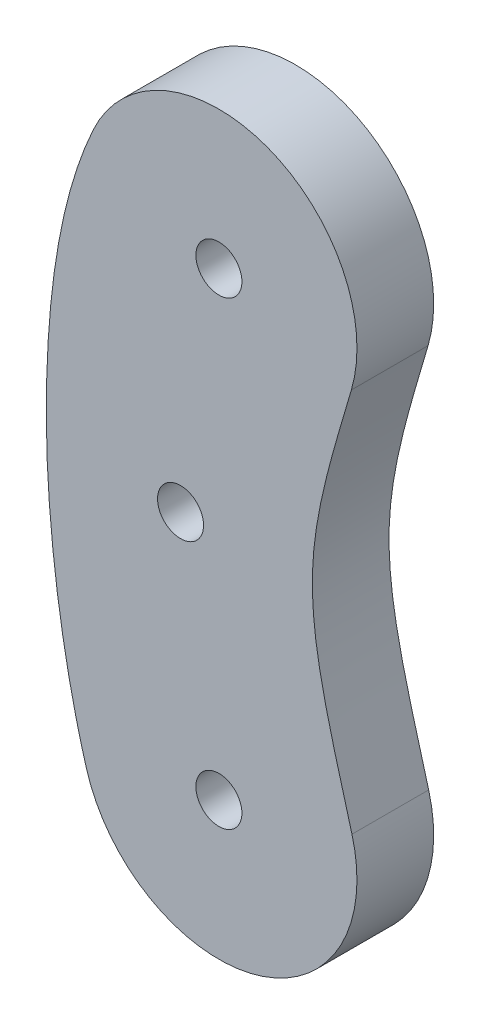
ISO-10303-21;
HEADER;
FILE_DESCRIPTION(('STEP AP214'),'2;1');
FILE_NAME('part.step','',(''),(''),'','','');
FILE_SCHEMA(('AUTOMOTIVE_DESIGN { 1 0 10303 214 1 1 1 1 }'));
ENDSEC;
DATA;
#1=APPLICATION_CONTEXT('core data for automotive mechanical design processes');
#2=APPLICATION_PROTOCOL_DEFINITION('international standard','automotive_design',2000,#1);
#3=PRODUCT_CONTEXT('',#1,'mechanical');
#4=PRODUCT('Part','Part','',(#3));
#5=PRODUCT_RELATED_PRODUCT_CATEGORY('part','',(#4));
#6=PRODUCT_DEFINITION_FORMATION('','',#4);
#7=PRODUCT_DEFINITION_CONTEXT('part definition',#1,'design');
#8=PRODUCT_DEFINITION('design','',#6,#7);
#9=PRODUCT_DEFINITION_SHAPE('','',#8);
#10=(LENGTH_UNIT() NAMED_UNIT(*) SI_UNIT(.MILLI.,.METRE.));
#11=(NAMED_UNIT(*) PLANE_ANGLE_UNIT() SI_UNIT($,.RADIAN.));
#12=(NAMED_UNIT(*) SI_UNIT($,.STERADIAN.) SOLID_ANGLE_UNIT());
#13=UNCERTAINTY_MEASURE_WITH_UNIT(LENGTH_MEASURE(1.E-05),#10,'distance_accuracy_value','');
#14=(GEOMETRIC_REPRESENTATION_CONTEXT(3) GLOBAL_UNCERTAINTY_ASSIGNED_CONTEXT((#13)) GLOBAL_UNIT_ASSIGNED_CONTEXT((#10,
#11,#12)) REPRESENTATION_CONTEXT('',''));
#15=CARTESIAN_POINT('',(0.,0.,0.));
#16=DIRECTION('',(0.,0.,1.));
#17=DIRECTION('',(1.,0.,0.));
#18=AXIS2_PLACEMENT_3D('',#15,#16,#17);
#19=CARTESIAN_POINT('',(-8.17760203971426,33.7585668651843,5.));
#20=CARTESIAN_POINT('',(-10.2391210109085,29.273271711889,5.));
#21=CARTESIAN_POINT('',(-11.4499871436267,20.9432649609992,5.));
#22=CARTESIAN_POINT('',(-11.1136661993933,8.88333020494128,5.));
#23=CARTESIAN_POINT('',(-9.76929203164389,1.29153840888373,5.));
#24=CARTESIAN_POINT('',(-8.62926724426962,-2.55651067413679,5.));
#25=B_SPLINE_CURVE_WITH_KNOTS('',3,(#19,#20,#21,#22,#23,#24),.UNSPECIFIED.,.F.,.F.,(4,1,1,4),
(0.,0.412769953090138,0.646915450195841,1.),.UNSPECIFIED.);
#26=DIRECTION('',(0.,0.,-1.));
#27=VECTOR('',#26,1.);
#28=SURFACE_OF_LINEAR_EXTRUSION('',#25,#27);
#29=CARTESIAN_POINT('',(-8.17760203971426,33.7585668651843,0.));
#30=CARTESIAN_POINT('',(-10.2391210109085,29.273271711889,0.));
#31=CARTESIAN_POINT('',(-11.4499871436267,20.9432649609992,0.));
#32=CARTESIAN_POINT('',(-11.1136661993933,8.88333020494128,0.));
#33=CARTESIAN_POINT('',(-9.76929203164389,1.29153840888373,0.));
#34=CARTESIAN_POINT('',(-8.62926724426962,-2.55651067413679,0.));
#35=B_SPLINE_CURVE_WITH_KNOTS('',3,(#29,#30,#31,#32,#33,#34),.UNSPECIFIED.,.F.,.F.,(4,1,1,4),
(0.,0.412769953090138,0.646915450195841,1.),.UNSPECIFIED.);
#36=CARTESIAN_POINT('',(-8.17760203971426,33.7585668651843,0.));
#37=VERTEX_POINT('',#36);
#38=CARTESIAN_POINT('',(-8.62926724426962,-2.55651067413679,0.));
#39=VERTEX_POINT('',#38);
#40=EDGE_CURVE('E122',#37,#39,#35,.T.);
#41=ORIENTED_EDGE('',*,*,#40,.T.);
#42=DIRECTION('',(0.,0.,-1.));
#43=VECTOR('',#42,1.);
#44=CARTESIAN_POINT('',(-8.62926724426962,-2.55651067413679,5.));
#45=LINE('',#44,#43);
#46=CARTESIAN_POINT('',(-8.62926724426962,-2.55651067413679,5.));
#47=VERTEX_POINT('',#46);
#48=EDGE_CURVE('E11',#47,#39,#45,.T.);
#49=ORIENTED_EDGE('',*,*,#48,.F.);
#50=CARTESIAN_POINT('',(-8.17760203971426,33.7585668651843,5.));
#51=VERTEX_POINT('',#50);
#52=EDGE_CURVE('E90',#51,#47,#25,.T.);
#53=ORIENTED_EDGE('',*,*,#52,.F.);
#54=DIRECTION('',(0.,0.,-1.));
#55=VECTOR('',#54,1.);
#56=CARTESIAN_POINT('',(-8.17760203971426,33.7585668651843,5.));
#57=LINE('',#56,#55);
#58=EDGE_CURVE('E99',#51,#37,#57,.T.);
#59=ORIENTED_EDGE('',*,*,#58,.T.);
#60=EDGE_LOOP('',(#41,#49,#53,#59));
#61=FACE_BOUND('',#60,.T.);
#62=ADVANCED_FACE('F36',(#61),#28,.F.);
#63=CARTESIAN_POINT('',(0.,0.,5.));
#64=DIRECTION('',(0.,0.,-1.));
#65=DIRECTION('',(-1.,0.,0.));
#66=AXIS2_PLACEMENT_3D('',#63,#64,#65);
#67=CYLINDRICAL_SURFACE('',#66,9.);
#68=CARTESIAN_POINT('',(0.,0.,0.));
#69=DIRECTION('',(0.,0.,1.));
#70=DIRECTION('',(1.,0.,0.));
#71=AXIS2_PLACEMENT_3D('',#68,#69,#70);
#72=CIRCLE('',#71,9.);
#73=CARTESIAN_POINT('',(8.67370320383982,2.40143139225313,0.));
#74=VERTEX_POINT('',#73);
#75=EDGE_CURVE('E94',#39,#74,#72,.T.);
#76=ORIENTED_EDGE('',*,*,#75,.T.);
#77=DIRECTION('',(0.,0.,-1.));
#78=VECTOR('',#77,1.);
#79=CARTESIAN_POINT('',(8.67370320383982,2.40143139225313,5.));
#80=LINE('',#79,#78);
#81=CARTESIAN_POINT('',(8.67370320383982,2.40143139225313,5.));
#82=VERTEX_POINT('',#81);
#83=EDGE_CURVE('E46',#82,#74,#80,.T.);
#84=ORIENTED_EDGE('',*,*,#83,.F.);
#85=CARTESIAN_POINT('',(0.,0.,5.));
#86=DIRECTION('',(0.,0.,1.));
#87=DIRECTION('',(1.,0.,0.));
#88=AXIS2_PLACEMENT_3D('',#85,#86,#87);
#89=CIRCLE('',#88,9.);
#90=EDGE_CURVE('E85',#47,#82,#89,.T.);
#91=ORIENTED_EDGE('',*,*,#90,.F.);
#92=ORIENTED_EDGE('',*,*,#48,.T.);
#93=EDGE_LOOP('',(#76,#84,#91,#92));
#94=FACE_BOUND('',#93,.T.);
#95=ADVANCED_FACE('F93',(#94),#67,.T.);
#96=CARTESIAN_POINT('',(8.67370320383982,2.40143139225313,5.));
#97=CARTESIAN_POINT('',(7.07592914316869,8.17241366297816,5.));
#98=CARTESIAN_POINT('',(4.92199901240161,15.3247108466899,5.));
#99=CARTESIAN_POINT('',(7.43040424656678,23.3690768319561,5.));
#100=CARTESIAN_POINT('',(8.63398973606181,27.4594840607508,5.));
#101=B_SPLINE_CURVE_WITH_KNOTS('',3,(#96,#97,#98,#99,#100),.UNSPECIFIED.,.F.,.F.,(4,1,4),(0.,
0.557287963788278,1.),.UNSPECIFIED.);
#102=DIRECTION('',(0.,0.,-1.));
#103=VECTOR('',#102,1.);
#104=SURFACE_OF_LINEAR_EXTRUSION('',#101,#103);
#105=CARTESIAN_POINT('',(8.67370320383982,2.40143139225313,0.));
#106=CARTESIAN_POINT('',(7.07592914316869,8.17241366297816,0.));
#107=CARTESIAN_POINT('',(4.92199901240161,15.3247108466899,0.));
#108=CARTESIAN_POINT('',(7.43040424656678,23.3690768319561,0.));
#109=CARTESIAN_POINT('',(8.63398973606181,27.4594840607508,0.));
#110=B_SPLINE_CURVE_WITH_KNOTS('',3,(#105,#106,#107,#108,#109),.UNSPECIFIED.,.F.,.F.,(4,1,4),
(0.,0.557287963788278,1.),.UNSPECIFIED.);
#111=CARTESIAN_POINT('',(8.63398973606181,27.4594840607508,0.));
#112=VERTEX_POINT('',#111);
#113=EDGE_CURVE('E72',#74,#112,#110,.T.);
#114=ORIENTED_EDGE('',*,*,#113,.T.);
#115=DIRECTION('',(0.,0.,-1.));
#116=VECTOR('',#115,1.);
#117=CARTESIAN_POINT('',(8.63398973606181,27.4594840607508,5.));
#118=LINE('',#117,#116);
#119=CARTESIAN_POINT('',(8.63398973606181,27.4594840607508,5.));
#120=VERTEX_POINT('',#119);
#121=EDGE_CURVE('E95',#120,#112,#118,.T.);
#122=ORIENTED_EDGE('',*,*,#121,.F.);
#123=EDGE_CURVE('E88',#82,#120,#101,.T.);
#124=ORIENTED_EDGE('',*,*,#123,.F.);
#125=ORIENTED_EDGE('',*,*,#83,.T.);
#126=EDGE_LOOP('',(#114,#122,#124,#125));
#127=FACE_BOUND('',#126,.T.);
#128=ADVANCED_FACE('F97',(#127),#104,.F.);
#129=CARTESIAN_POINT('',(0.,30.,5.));
#130=DIRECTION('',(0.,0.,-1.));
#131=DIRECTION('',(-1.,0.,0.));
#132=AXIS2_PLACEMENT_3D('',#129,#130,#131);
#133=CYLINDRICAL_SURFACE('',#132,9.);
#134=CARTESIAN_POINT('',(0.,30.,0.));
#135=DIRECTION('',(0.,0.,1.));
#136=DIRECTION('',(1.,0.,0.));
#137=AXIS2_PLACEMENT_3D('',#134,#135,#136);
#138=CIRCLE('',#137,9.);
#139=EDGE_CURVE('E78',#112,#37,#138,.T.);
#140=ORIENTED_EDGE('',*,*,#139,.T.);
#141=ORIENTED_EDGE('',*,*,#58,.F.);
#142=CARTESIAN_POINT('',(0.,30.,5.));
#143=DIRECTION('',(0.,0.,1.));
#144=DIRECTION('',(1.,0.,0.));
#145=AXIS2_PLACEMENT_3D('',#142,#143,#144);
#146=CIRCLE('',#145,9.);
#147=EDGE_CURVE('E55',#120,#51,#146,.T.);
#148=ORIENTED_EDGE('',*,*,#147,.F.);
#149=ORIENTED_EDGE('',*,*,#121,.T.);
#150=EDGE_LOOP('',(#140,#141,#148,#149));
#151=FACE_BOUND('',#150,.T.);
#152=ADVANCED_FACE('F111',(#151),#133,.T.);
#153=CARTESIAN_POINT('',(0.,0.,5.));
#154=DIRECTION('',(0.,0.,1.));
#155=DIRECTION('',(1.,0.,0.));
#156=AXIS2_PLACEMENT_3D('',#153,#154,#155);
#157=PLANE('',#156);
#158=CARTESIAN_POINT('',(-2.5,15.,5.));
#159=DIRECTION('',(0.,0.,1.));
#160=DIRECTION('',(1.,0.,0.));
#161=AXIS2_PLACEMENT_3D('',#158,#159,#160);
#162=CIRCLE('',#161,1.5);
#163=CARTESIAN_POINT('',(-1.,15.,5.));
#164=VERTEX_POINT('',#163);
#165=EDGE_CURVE('E155',#164,#164,#162,.T.);
#166=ORIENTED_EDGE('',*,*,#165,.F.);
#167=EDGE_LOOP('',(#166));
#168=FACE_BOUND('',#167,.T.);
#169=CARTESIAN_POINT('',(0.,30.,5.));
#170=DIRECTION('',(0.,0.,1.));
#171=DIRECTION('',(1.,0.,0.));
#172=AXIS2_PLACEMENT_3D('',#169,#170,#171);
#173=CIRCLE('',#172,1.5);
#174=CARTESIAN_POINT('',(1.5,30.,5.));
#175=VERTEX_POINT('',#174);
#176=EDGE_CURVE('E144',#175,#175,#173,.T.);
#177=ORIENTED_EDGE('',*,*,#176,.F.);
#178=EDGE_LOOP('',(#177));
#179=FACE_BOUND('',#178,.T.);
#180=CARTESIAN_POINT('',(0.,0.,5.));
#181=DIRECTION('',(0.,0.,1.));
#182=DIRECTION('',(1.,0.,0.));
#183=AXIS2_PLACEMENT_3D('',#180,#181,#182);
#184=CIRCLE('',#183,1.5);
#185=CARTESIAN_POINT('',(1.5,0.,5.));
#186=VERTEX_POINT('',#185);
#187=EDGE_CURVE('E148',#186,#186,#184,.T.);
#188=ORIENTED_EDGE('',*,*,#187,.F.);
#189=EDGE_LOOP('',(#188));
#190=FACE_BOUND('',#189,.T.);
#191=ORIENTED_EDGE('',*,*,#52,.T.);
#192=ORIENTED_EDGE('',*,*,#90,.T.);
#193=ORIENTED_EDGE('',*,*,#123,.T.);
#194=ORIENTED_EDGE('',*,*,#147,.T.);
#195=EDGE_LOOP('',(#191,#192,#193,#194));
#196=FACE_BOUND('',#195,.T.);
#197=ADVANCED_FACE('F86',(#168,#179,#190,#196),#157,.T.);
#198=CARTESIAN_POINT('',(0.,0.,0.));
#199=DIRECTION('',(0.,0.,1.));
#200=DIRECTION('',(1.,0.,0.));
#201=AXIS2_PLACEMENT_3D('',#198,#199,#200);
#202=PLANE('',#201);
#203=CARTESIAN_POINT('',(-2.5,15.,0.));
#204=DIRECTION('',(0.,0.,1.));
#205=DIRECTION('',(1.,0.,0.));
#206=AXIS2_PLACEMENT_3D('',#203,#204,#205);
#207=CIRCLE('',#206,1.5);
#208=CARTESIAN_POINT('',(-1.,15.,0.));
#209=VERTEX_POINT('',#208);
#210=EDGE_CURVE('E40',#209,#209,#207,.T.);
#211=ORIENTED_EDGE('',*,*,#210,.T.);
#212=EDGE_LOOP('',(#211));
#213=FACE_BOUND('',#212,.T.);
#214=CARTESIAN_POINT('',(0.,30.,0.));
#215=DIRECTION('',(0.,0.,1.));
#216=DIRECTION('',(1.,0.,0.));
#217=AXIS2_PLACEMENT_3D('',#214,#215,#216);
#218=CIRCLE('',#217,1.5);
#219=CARTESIAN_POINT('',(1.5,30.,0.));
#220=VERTEX_POINT('',#219);
#221=EDGE_CURVE('E124',#220,#220,#218,.T.);
#222=ORIENTED_EDGE('',*,*,#221,.T.);
#223=EDGE_LOOP('',(#222));
#224=FACE_BOUND('',#223,.T.);
#225=CARTESIAN_POINT('',(0.,0.,0.));
#226=DIRECTION('',(0.,0.,1.));
#227=DIRECTION('',(1.,0.,0.));
#228=AXIS2_PLACEMENT_3D('',#225,#226,#227);
#229=CIRCLE('',#228,1.5);
#230=CARTESIAN_POINT('',(1.5,0.,0.));
#231=VERTEX_POINT('',#230);
#232=EDGE_CURVE('E127',#231,#231,#229,.T.);
#233=ORIENTED_EDGE('',*,*,#232,.T.);
#234=EDGE_LOOP('',(#233));
#235=FACE_BOUND('',#234,.T.);
#236=ORIENTED_EDGE('',*,*,#40,.F.);
#237=ORIENTED_EDGE('',*,*,#139,.F.);
#238=ORIENTED_EDGE('',*,*,#113,.F.);
#239=ORIENTED_EDGE('',*,*,#75,.F.);
#240=EDGE_LOOP('',(#236,#237,#238,#239));
#241=FACE_BOUND('',#240,.T.);
#242=ADVANCED_FACE('F168',(#213,#224,#235,#241),#202,.F.);
#243=CARTESIAN_POINT('',(0.,0.,-5.));
#244=DIRECTION('',(0.,0.,1.));
#245=DIRECTION('',(1.,0.,0.));
#246=AXIS2_PLACEMENT_3D('',#243,#244,#245);
#247=CYLINDRICAL_SURFACE('',#246,1.5);
#248=ORIENTED_EDGE('',*,*,#187,.T.);
#249=EDGE_LOOP('',(#248));
#250=FACE_BOUND('',#249,.T.);
#251=ORIENTED_EDGE('',*,*,#232,.F.);
#252=EDGE_LOOP('',(#251));
#253=FACE_BOUND('',#252,.T.);
#254=ADVANCED_FACE('F178',(#250,#253),#247,.F.);
#255=CARTESIAN_POINT('',(0.,30.,-5.));
#256=DIRECTION('',(0.,0.,1.));
#257=DIRECTION('',(1.,0.,0.));
#258=AXIS2_PLACEMENT_3D('',#255,#256,#257);
#259=CYLINDRICAL_SURFACE('',#258,1.5);
#260=ORIENTED_EDGE('',*,*,#176,.T.);
#261=EDGE_LOOP('',(#260));
#262=FACE_BOUND('',#261,.T.);
#263=ORIENTED_EDGE('',*,*,#221,.F.);
#264=EDGE_LOOP('',(#263));
#265=FACE_BOUND('',#264,.T.);
#266=ADVANCED_FACE('F173',(#262,#265),#259,.F.);
#267=CARTESIAN_POINT('',(-2.5,15.,-5.));
#268=DIRECTION('',(0.,0.,1.));
#269=DIRECTION('',(1.,0.,0.));
#270=AXIS2_PLACEMENT_3D('',#267,#268,#269);
#271=CYLINDRICAL_SURFACE('',#270,1.5);
#272=ORIENTED_EDGE('',*,*,#165,.T.);
#273=EDGE_LOOP('',(#272));
#274=FACE_BOUND('',#273,.T.);
#275=ORIENTED_EDGE('',*,*,#210,.F.);
#276=EDGE_LOOP('',(#275));
#277=FACE_BOUND('',#276,.T.);
#278=ADVANCED_FACE('F171',(#274,#277),#271,.F.);
#279=CLOSED_SHELL('',(#62,#95,#128,#152,#197,#242,#254,#266,#278));
#280=MANIFOLD_SOLID_BREP('B2',#279);
#281=ADVANCED_BREP_SHAPE_REPRESENTATION('',(#18,#280),#14);
#282=SHAPE_DEFINITION_REPRESENTATION(#9,#281);
ENDSEC;
END-ISO-10303-21;
